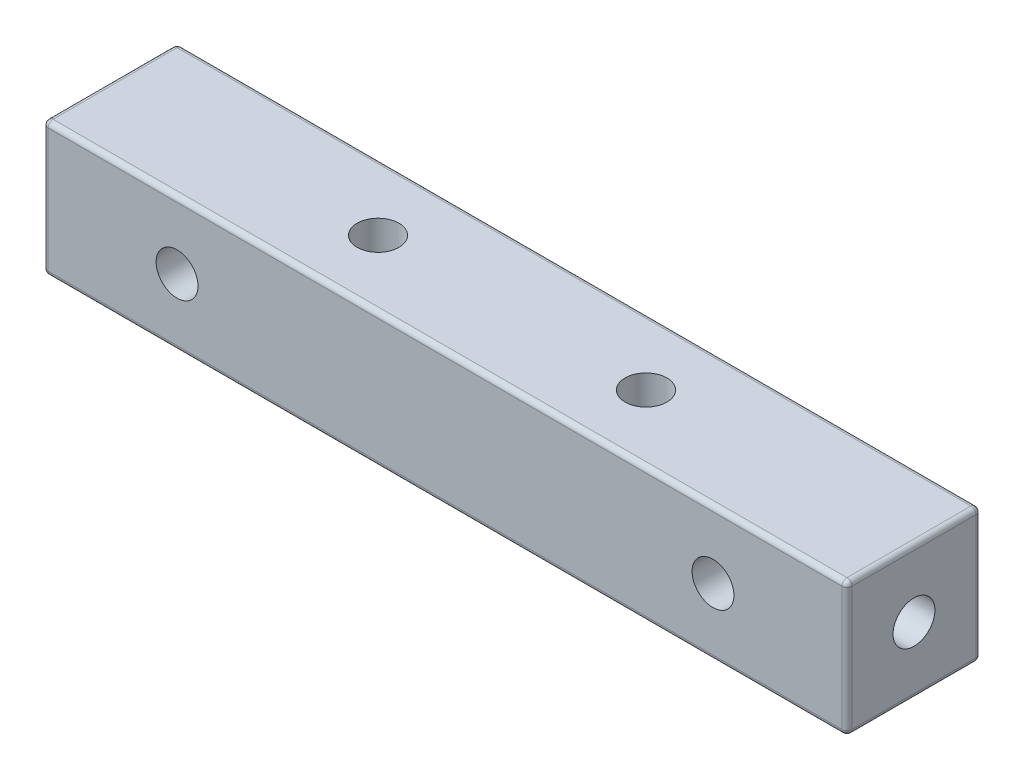
ISO-10303-21;
HEADER;
FILE_DESCRIPTION(('STEP AP214'),'2;1');
FILE_NAME('part.step','',(''),(''),'','','');
FILE_SCHEMA(('AUTOMOTIVE_DESIGN { 1 0 10303 214 1 1 1 1 }'));
ENDSEC;
DATA;
#1=APPLICATION_CONTEXT('core data for automotive mechanical design processes');
#2=APPLICATION_PROTOCOL_DEFINITION('international standard','automotive_design',2000,#1);
#3=PRODUCT_CONTEXT('',#1,'mechanical');
#4=PRODUCT('Part','Part','',(#3));
#5=PRODUCT_RELATED_PRODUCT_CATEGORY('part','',(#4));
#6=PRODUCT_DEFINITION_FORMATION('','',#4);
#7=PRODUCT_DEFINITION_CONTEXT('part definition',#1,'design');
#8=PRODUCT_DEFINITION('design','',#6,#7);
#9=PRODUCT_DEFINITION_SHAPE('','',#8);
#10=(LENGTH_UNIT() NAMED_UNIT(*) SI_UNIT(.MILLI.,.METRE.));
#11=(NAMED_UNIT(*) PLANE_ANGLE_UNIT() SI_UNIT($,.RADIAN.));
#12=(NAMED_UNIT(*) SI_UNIT($,.STERADIAN.) SOLID_ANGLE_UNIT());
#13=UNCERTAINTY_MEASURE_WITH_UNIT(LENGTH_MEASURE(1.E-05),#10,'distance_accuracy_value','');
#14=(GEOMETRIC_REPRESENTATION_CONTEXT(3) GLOBAL_UNCERTAINTY_ASSIGNED_CONTEXT((#13)) GLOBAL_UNIT_ASSIGNED_CONTEXT((#10,
#11,#12)) REPRESENTATION_CONTEXT('',''));
#15=CARTESIAN_POINT('',(0.,0.,0.));
#16=DIRECTION('',(0.,0.,1.));
#17=DIRECTION('',(1.,0.,0.));
#18=AXIS2_PLACEMENT_3D('',#15,#16,#17);
#19=CARTESIAN_POINT('',(24.,-4.,-4.));
#20=DIRECTION('',(0.,0.,1.));
#21=DIRECTION('',(0.,-1.,0.));
#22=AXIS2_PLACEMENT_3D('',#19,#20,#21);
#23=PLANE('',#22);
#24=CARTESIAN_POINT('',(-16.,0.,-4.));
#25=DIRECTION('',(0.,0.,1.));
#26=DIRECTION('',(1.,0.,0.));
#27=AXIS2_PLACEMENT_3D('',#24,#25,#26);
#28=CIRCLE('',#27,1.25);
#29=CARTESIAN_POINT('',(-14.75,0.,-4.));
#30=VERTEX_POINT('',#29);
#31=EDGE_CURVE('E152',#30,#30,#28,.T.);
#32=ORIENTED_EDGE('',*,*,#31,.T.);
#33=EDGE_LOOP('',(#32));
#34=FACE_BOUND('',#33,.T.);
#35=CARTESIAN_POINT('',(16.,0.,-4.));
#36=DIRECTION('',(0.,0.,1.));
#37=DIRECTION('',(1.,0.,0.));
#38=AXIS2_PLACEMENT_3D('',#35,#36,#37);
#39=CIRCLE('',#38,1.25);
#40=CARTESIAN_POINT('',(17.25,0.,-4.));
#41=VERTEX_POINT('',#40);
#42=EDGE_CURVE('E147',#41,#41,#39,.T.);
#43=ORIENTED_EDGE('',*,*,#42,.T.);
#44=EDGE_LOOP('',(#43));
#45=FACE_BOUND('',#44,.T.);
#46=DIRECTION('',(0.,1.,0.));
#47=VECTOR('',#46,1.);
#48=CARTESIAN_POINT('',(23.7,-4.,-4.));
#49=LINE('',#48,#47);
#50=CARTESIAN_POINT('',(23.7,3.7,-4.));
#51=VERTEX_POINT('',#50);
#52=CARTESIAN_POINT('',(23.7,-3.7,-4.));
#53=VERTEX_POINT('',#52);
#54=EDGE_CURVE('E175',#51,#53,#49,.F.);
#55=ORIENTED_EDGE('',*,*,#54,.T.);
#56=DIRECTION('',(-1.,0.,0.));
#57=VECTOR('',#56,1.);
#58=CARTESIAN_POINT('',(24.,-3.7,-4.));
#59=LINE('',#58,#57);
#60=CARTESIAN_POINT('',(-23.7,-3.7,-4.));
#61=VERTEX_POINT('',#60);
#62=EDGE_CURVE('E181',#53,#61,#59,.T.);
#63=ORIENTED_EDGE('',*,*,#62,.T.);
#64=DIRECTION('',(0.,1.,0.));
#65=VECTOR('',#64,1.);
#66=CARTESIAN_POINT('',(-23.7,4.,-4.));
#67=LINE('',#66,#65);
#68=CARTESIAN_POINT('',(-23.7,3.7,-4.));
#69=VERTEX_POINT('',#68);
#70=EDGE_CURVE('E178',#61,#69,#67,.T.);
#71=ORIENTED_EDGE('',*,*,#70,.T.);
#72=DIRECTION('',(-1.,0.,0.));
#73=VECTOR('',#72,1.);
#74=CARTESIAN_POINT('',(24.,3.7,-4.));
#75=LINE('',#74,#73);
#76=EDGE_CURVE('E173',#69,#51,#75,.F.);
#77=ORIENTED_EDGE('',*,*,#76,.T.);
#78=EDGE_LOOP('',(#55,#63,#71,#77));
#79=FACE_BOUND('',#78,.T.);
#80=ADVANCED_FACE('F39',(#34,#45,#79),#23,.F.);
#81=CARTESIAN_POINT('',(24.,4.,4.));
#82=DIRECTION('',(0.,-1.,0.));
#83=DIRECTION('',(0.,0.,-1.));
#84=AXIS2_PLACEMENT_3D('',#81,#82,#83);
#85=PLANE('',#84);
#86=CARTESIAN_POINT('',(-8.,4.,0.));
#87=DIRECTION('',(0.,1.,0.));
#88=DIRECTION('',(0.,0.,1.));
#89=AXIS2_PLACEMENT_3D('',#86,#87,#88);
#90=CIRCLE('',#89,1.25);
#91=CARTESIAN_POINT('',(-8.,4.,1.25));
#92=VERTEX_POINT('',#91);
#93=EDGE_CURVE('E154',#92,#92,#90,.T.);
#94=ORIENTED_EDGE('',*,*,#93,.F.);
#95=EDGE_LOOP('',(#94));
#96=FACE_BOUND('',#95,.T.);
#97=CARTESIAN_POINT('',(8.,4.,0.));
#98=DIRECTION('',(0.,1.,0.));
#99=DIRECTION('',(0.,0.,1.));
#100=AXIS2_PLACEMENT_3D('',#97,#98,#99);
#101=CIRCLE('',#100,1.25);
#102=CARTESIAN_POINT('',(8.,4.,1.25));
#103=VERTEX_POINT('',#102);
#104=EDGE_CURVE('E166',#103,#103,#101,.T.);
#105=ORIENTED_EDGE('',*,*,#104,.F.);
#106=EDGE_LOOP('',(#105));
#107=FACE_BOUND('',#106,.T.);
#108=DIRECTION('',(0.,0.,1.));
#109=VECTOR('',#108,1.);
#110=CARTESIAN_POINT('',(-23.7,4.,4.));
#111=LINE('',#110,#109);
#112=CARTESIAN_POINT('',(-23.7,4.,-3.7));
#113=VERTEX_POINT('',#112);
#114=CARTESIAN_POINT('',(-23.7,4.,3.7));
#115=VERTEX_POINT('',#114);
#116=EDGE_CURVE('E196',#113,#115,#111,.T.);
#117=ORIENTED_EDGE('',*,*,#116,.T.);
#118=DIRECTION('',(-1.,0.,0.));
#119=VECTOR('',#118,1.);
#120=CARTESIAN_POINT('',(24.,4.,3.7));
#121=LINE('',#120,#119);
#122=CARTESIAN_POINT('',(23.7,4.,3.7));
#123=VERTEX_POINT('',#122);
#124=EDGE_CURVE('E199',#115,#123,#121,.F.);
#125=ORIENTED_EDGE('',*,*,#124,.T.);
#126=DIRECTION('',(0.,0.,1.));
#127=VECTOR('',#126,1.);
#128=CARTESIAN_POINT('',(23.7,4.,4.));
#129=LINE('',#128,#127);
#130=CARTESIAN_POINT('',(23.7,4.,-3.7));
#131=VERTEX_POINT('',#130);
#132=EDGE_CURVE('E194',#123,#131,#129,.F.);
#133=ORIENTED_EDGE('',*,*,#132,.T.);
#134=DIRECTION('',(-1.,0.,0.));
#135=VECTOR('',#134,1.);
#136=CARTESIAN_POINT('',(24.,4.,-3.7));
#137=LINE('',#136,#135);
#138=EDGE_CURVE('E192',#131,#113,#137,.T.);
#139=ORIENTED_EDGE('',*,*,#138,.T.);
#140=EDGE_LOOP('',(#117,#125,#133,#139));
#141=FACE_BOUND('',#140,.T.);
#142=ADVANCED_FACE('F353',(#96,#107,#141),#85,.F.);
#143=CARTESIAN_POINT('',(24.,-4.,4.));
#144=DIRECTION('',(0.,0.,-1.));
#145=DIRECTION('',(-1.,0.,0.));
#146=AXIS2_PLACEMENT_3D('',#143,#144,#145);
#147=PLANE('',#146);
#148=CARTESIAN_POINT('',(-16.,0.,4.));
#149=DIRECTION('',(0.,0.,1.));
#150=DIRECTION('',(1.,0.,0.));
#151=AXIS2_PLACEMENT_3D('',#148,#149,#150);
#152=CIRCLE('',#151,1.25);
#153=CARTESIAN_POINT('',(-14.75,0.,4.));
#154=VERTEX_POINT('',#153);
#155=EDGE_CURVE('E157',#154,#154,#152,.T.);
#156=ORIENTED_EDGE('',*,*,#155,.F.);
#157=EDGE_LOOP('',(#156));
#158=FACE_BOUND('',#157,.T.);
#159=CARTESIAN_POINT('',(16.,0.,4.));
#160=DIRECTION('',(0.,0.,1.));
#161=DIRECTION('',(1.,0.,0.));
#162=AXIS2_PLACEMENT_3D('',#159,#160,#161);
#163=CIRCLE('',#162,1.25);
#164=CARTESIAN_POINT('',(17.25,0.,4.));
#165=VERTEX_POINT('',#164);
#166=EDGE_CURVE('E150',#165,#165,#163,.T.);
#167=ORIENTED_EDGE('',*,*,#166,.F.);
#168=EDGE_LOOP('',(#167));
#169=FACE_BOUND('',#168,.T.);
#170=DIRECTION('',(0.,-1.,0.));
#171=VECTOR('',#170,1.);
#172=CARTESIAN_POINT('',(23.7,-4.,4.));
#173=LINE('',#172,#171);
#174=CARTESIAN_POINT('',(23.7,-3.7,4.));
#175=VERTEX_POINT('',#174);
#176=CARTESIAN_POINT('',(23.7,3.7,4.));
#177=VERTEX_POINT('',#176);
#178=EDGE_CURVE('E203',#175,#177,#173,.F.);
#179=ORIENTED_EDGE('',*,*,#178,.T.);
#180=DIRECTION('',(-1.,0.,0.));
#181=VECTOR('',#180,1.);
#182=CARTESIAN_POINT('',(24.,3.7,4.));
#183=LINE('',#182,#181);
#184=CARTESIAN_POINT('',(-23.7,3.7,4.));
#185=VERTEX_POINT('',#184);
#186=EDGE_CURVE('E208',#177,#185,#183,.T.);
#187=ORIENTED_EDGE('',*,*,#186,.T.);
#188=DIRECTION('',(0.,-1.,0.));
#189=VECTOR('',#188,1.);
#190=CARTESIAN_POINT('',(-23.7,-4.,4.));
#191=LINE('',#190,#189);
#192=CARTESIAN_POINT('',(-23.7,-3.7,4.));
#193=VERTEX_POINT('',#192);
#194=EDGE_CURVE('E205',#185,#193,#191,.T.);
#195=ORIENTED_EDGE('',*,*,#194,.T.);
#196=DIRECTION('',(-1.,0.,0.));
#197=VECTOR('',#196,1.);
#198=CARTESIAN_POINT('',(24.,-3.7,4.));
#199=LINE('',#198,#197);
#200=EDGE_CURVE('E201',#193,#175,#199,.F.);
#201=ORIENTED_EDGE('',*,*,#200,.T.);
#202=EDGE_LOOP('',(#179,#187,#195,#201));
#203=FACE_BOUND('',#202,.T.);
#204=ADVANCED_FACE('F416',(#158,#169,#203),#147,.F.);
#205=CARTESIAN_POINT('',(24.,-4.,4.));
#206=DIRECTION('',(0.,1.,0.));
#207=DIRECTION('',(0.,0.,1.));
#208=AXIS2_PLACEMENT_3D('',#205,#206,#207);
#209=PLANE('',#208);
#210=CARTESIAN_POINT('',(-8.,-4.,0.));
#211=DIRECTION('',(0.,1.,0.));
#212=DIRECTION('',(0.,0.,1.));
#213=AXIS2_PLACEMENT_3D('',#210,#211,#212);
#214=CIRCLE('',#213,1.25);
#215=CARTESIAN_POINT('',(-8.,-4.,1.25));
#216=VERTEX_POINT('',#215);
#217=EDGE_CURVE('E163',#216,#216,#214,.T.);
#218=ORIENTED_EDGE('',*,*,#217,.T.);
#219=EDGE_LOOP('',(#218));
#220=FACE_BOUND('',#219,.T.);
#221=CARTESIAN_POINT('',(8.,-4.,0.));
#222=DIRECTION('',(0.,1.,0.));
#223=DIRECTION('',(0.,0.,1.));
#224=AXIS2_PLACEMENT_3D('',#221,#222,#223);
#225=CIRCLE('',#224,1.25);
#226=CARTESIAN_POINT('',(8.,-4.,1.24999999999999));
#227=VERTEX_POINT('',#226);
#228=EDGE_CURVE('E169',#227,#227,#225,.T.);
#229=ORIENTED_EDGE('',*,*,#228,.T.);
#230=EDGE_LOOP('',(#229));
#231=FACE_BOUND('',#230,.T.);
#232=DIRECTION('',(0.,0.,-1.));
#233=VECTOR('',#232,1.);
#234=CARTESIAN_POINT('',(-23.7,-4.,-4.));
#235=LINE('',#234,#233);
#236=CARTESIAN_POINT('',(-23.7,-4.,3.7));
#237=VERTEX_POINT('',#236);
#238=CARTESIAN_POINT('',(-23.7,-4.,-3.7));
#239=VERTEX_POINT('',#238);
#240=EDGE_CURVE('E214',#237,#239,#235,.T.);
#241=ORIENTED_EDGE('',*,*,#240,.T.);
#242=DIRECTION('',(-1.,0.,0.));
#243=VECTOR('',#242,1.);
#244=CARTESIAN_POINT('',(24.,-4.,-3.7));
#245=LINE('',#244,#243);
#246=CARTESIAN_POINT('',(23.7,-4.,-3.7));
#247=VERTEX_POINT('',#246);
#248=EDGE_CURVE('E217',#239,#247,#245,.F.);
#249=ORIENTED_EDGE('',*,*,#248,.T.);
#250=DIRECTION('',(0.,0.,-1.));
#251=VECTOR('',#250,1.);
#252=CARTESIAN_POINT('',(23.7,-4.,4.));
#253=LINE('',#252,#251);
#254=CARTESIAN_POINT('',(23.7,-4.,3.7));
#255=VERTEX_POINT('',#254);
#256=EDGE_CURVE('E212',#247,#255,#253,.F.);
#257=ORIENTED_EDGE('',*,*,#256,.T.);
#258=DIRECTION('',(-1.,0.,0.));
#259=VECTOR('',#258,1.);
#260=CARTESIAN_POINT('',(24.,-4.,3.7));
#261=LINE('',#260,#259);
#262=EDGE_CURVE('E210',#255,#237,#261,.T.);
#263=ORIENTED_EDGE('',*,*,#262,.T.);
#264=EDGE_LOOP('',(#241,#249,#257,#263));
#265=FACE_BOUND('',#264,.T.);
#266=ADVANCED_FACE('F315',(#220,#231,#265),#209,.F.);
#267=CARTESIAN_POINT('',(24.,0.,0.));
#268=DIRECTION('',(-1.,0.,0.));
#269=DIRECTION('',(0.,0.,1.));
#270=AXIS2_PLACEMENT_3D('',#267,#268,#269);
#271=PLANE('',#270);
#272=CARTESIAN_POINT('',(24.,0.,0.));
#273=DIRECTION('',(1.,0.,0.));
#274=DIRECTION('',(0.,0.,-1.));
#275=AXIS2_PLACEMENT_3D('',#272,#273,#274);
#276=CIRCLE('',#275,1.25);
#277=CARTESIAN_POINT('',(24.,0.,-1.25));
#278=VERTEX_POINT('',#277);
#279=EDGE_CURVE('E304',#278,#278,#276,.T.);
#280=ORIENTED_EDGE('',*,*,#279,.F.);
#281=EDGE_LOOP('',(#280));
#282=FACE_BOUND('',#281,.T.);
#283=DIRECTION('',(0.,0.,-1.));
#284=VECTOR('',#283,1.);
#285=CARTESIAN_POINT('',(24.,-3.7,0.));
#286=LINE('',#285,#284);
#287=CARTESIAN_POINT('',(24.,-3.7,3.7));
#288=VERTEX_POINT('',#287);
#289=CARTESIAN_POINT('',(24.,-3.7,-3.7));
#290=VERTEX_POINT('',#289);
#291=EDGE_CURVE('E219',#288,#290,#286,.T.);
#292=ORIENTED_EDGE('',*,*,#291,.T.);
#293=DIRECTION('',(0.,1.,0.));
#294=VECTOR('',#293,1.);
#295=CARTESIAN_POINT('',(24.,0.,-3.7));
#296=LINE('',#295,#294);
#297=CARTESIAN_POINT('',(24.,3.7,-3.7));
#298=VERTEX_POINT('',#297);
#299=EDGE_CURVE('E225',#290,#298,#296,.T.);
#300=ORIENTED_EDGE('',*,*,#299,.T.);
#301=DIRECTION('',(0.,0.,1.));
#302=VECTOR('',#301,1.);
#303=CARTESIAN_POINT('',(24.,3.7,0.));
#304=LINE('',#303,#302);
#305=CARTESIAN_POINT('',(24.,3.7,3.7));
#306=VERTEX_POINT('',#305);
#307=EDGE_CURVE('E223',#298,#306,#304,.T.);
#308=ORIENTED_EDGE('',*,*,#307,.T.);
#309=DIRECTION('',(0.,-1.,0.));
#310=VECTOR('',#309,1.);
#311=CARTESIAN_POINT('',(24.,0.,3.7));
#312=LINE('',#311,#310);
#313=EDGE_CURVE('E221',#306,#288,#312,.T.);
#314=ORIENTED_EDGE('',*,*,#313,.T.);
#315=EDGE_LOOP('',(#292,#300,#308,#314));
#316=FACE_BOUND('',#315,.T.);
#317=ADVANCED_FACE('F311',(#282,#316),#271,.F.);
#318=CARTESIAN_POINT('',(-24.,0.,0.));
#319=DIRECTION('',(-1.,0.,0.));
#320=DIRECTION('',(0.,0.,1.));
#321=AXIS2_PLACEMENT_3D('',#318,#319,#320);
#322=PLANE('',#321);
#323=CARTESIAN_POINT('',(-24.,0.,0.));
#324=DIRECTION('',(-1.,0.,0.));
#325=DIRECTION('',(0.,0.,1.));
#326=AXIS2_PLACEMENT_3D('',#323,#324,#325);
#327=CIRCLE('',#326,1.25);
#328=CARTESIAN_POINT('',(-24.,0.,1.25));
#329=VERTEX_POINT('',#328);
#330=EDGE_CURVE('E302',#329,#329,#327,.T.);
#331=ORIENTED_EDGE('',*,*,#330,.F.);
#332=EDGE_LOOP('',(#331));
#333=FACE_BOUND('',#332,.T.);
#334=DIRECTION('',(0.,0.,1.));
#335=VECTOR('',#334,1.);
#336=CARTESIAN_POINT('',(-24.,3.7,-4.));
#337=LINE('',#336,#335);
#338=CARTESIAN_POINT('',(-24.,3.7,3.7));
#339=VERTEX_POINT('',#338);
#340=CARTESIAN_POINT('',(-24.,3.7,-3.7));
#341=VERTEX_POINT('',#340);
#342=EDGE_CURVE('E187',#339,#341,#337,.F.);
#343=ORIENTED_EDGE('',*,*,#342,.T.);
#344=DIRECTION('',(0.,1.,0.));
#345=VECTOR('',#344,1.);
#346=CARTESIAN_POINT('',(-24.,-4.,-3.7));
#347=LINE('',#346,#345);
#348=CARTESIAN_POINT('',(-24.,-3.7,-3.7));
#349=VERTEX_POINT('',#348);
#350=EDGE_CURVE('E189',#341,#349,#347,.F.);
#351=ORIENTED_EDGE('',*,*,#350,.T.);
#352=DIRECTION('',(0.,0.,-1.));
#353=VECTOR('',#352,1.);
#354=CARTESIAN_POINT('',(-24.,-3.7,4.));
#355=LINE('',#354,#353);
#356=CARTESIAN_POINT('',(-24.,-3.7,3.7));
#357=VERTEX_POINT('',#356);
#358=EDGE_CURVE('E183',#349,#357,#355,.F.);
#359=ORIENTED_EDGE('',*,*,#358,.T.);
#360=DIRECTION('',(0.,-1.,0.));
#361=VECTOR('',#360,1.);
#362=CARTESIAN_POINT('',(-24.,4.,3.7));
#363=LINE('',#362,#361);
#364=EDGE_CURVE('E185',#357,#339,#363,.F.);
#365=ORIENTED_EDGE('',*,*,#364,.T.);
#366=EDGE_LOOP('',(#343,#351,#359,#365));
#367=FACE_BOUND('',#366,.T.);
#368=ADVANCED_FACE('F314',(#333,#367),#322,.T.);
#369=CARTESIAN_POINT('',(23.7,0.,3.7));
#370=DIRECTION('',(0.,-1.,0.));
#371=DIRECTION('',(0.,0.,-1.));
#372=AXIS2_PLACEMENT_3D('',#369,#370,#371);
#373=CYLINDRICAL_SURFACE('',#372,0.3);
#374=CARTESIAN_POINT('',(23.7,-3.7,3.7));
#375=DIRECTION('',(0.,-1.,0.));
#376=DIRECTION('',(0.,0.,-1.));
#377=AXIS2_PLACEMENT_3D('',#374,#375,#376);
#378=CIRCLE('',#377,0.3);
#379=EDGE_CURVE('E176',#288,#175,#378,.T.);
#380=ORIENTED_EDGE('',*,*,#379,.F.);
#381=ORIENTED_EDGE('',*,*,#313,.F.);
#382=CARTESIAN_POINT('',(23.7,3.7,3.7));
#383=DIRECTION('',(0.,1.,0.));
#384=DIRECTION('',(0.,0.,1.));
#385=AXIS2_PLACEMENT_3D('',#382,#383,#384);
#386=CIRCLE('',#385,0.3);
#387=EDGE_CURVE('E288',#177,#306,#386,.T.);
#388=ORIENTED_EDGE('',*,*,#387,.F.);
#389=ORIENTED_EDGE('',*,*,#178,.F.);
#390=EDGE_LOOP('',(#380,#381,#388,#389));
#391=FACE_BOUND('',#390,.T.);
#392=ADVANCED_FACE('F41',(#391),#373,.T.);
#393=CARTESIAN_POINT('',(23.7,-3.7,3.7));
#394=DIRECTION('',(0.,0.,1.));
#395=DIRECTION('',(1.,0.,0.));
#396=AXIS2_PLACEMENT_3D('',#393,#394,#395);
#397=SPHERICAL_SURFACE('',#396,0.3);
#398=CARTESIAN_POINT('',(23.7,-3.7,3.7));
#399=DIRECTION('',(0.,0.,1.));
#400=DIRECTION('',(1.,0.,0.));
#401=AXIS2_PLACEMENT_3D('',#398,#399,#400);
#402=CIRCLE('',#401,0.3);
#403=EDGE_CURVE('E282',#288,#255,#402,.F.);
#404=ORIENTED_EDGE('',*,*,#403,.F.);
#405=ORIENTED_EDGE('',*,*,#379,.T.);
#406=CARTESIAN_POINT('',(23.7,-3.7,3.7));
#407=DIRECTION('',(1.,0.,0.));
#408=DIRECTION('',(0.,0.,-1.));
#409=AXIS2_PLACEMENT_3D('',#406,#407,#408);
#410=CIRCLE('',#409,0.3);
#411=EDGE_CURVE('E285',#255,#175,#410,.F.);
#412=ORIENTED_EDGE('',*,*,#411,.F.);
#413=EDGE_LOOP('',(#404,#405,#412));
#414=FACE_BOUND('',#413,.T.);
#415=ADVANCED_FACE('F381',(#414),#397,.T.);
#416=CARTESIAN_POINT('',(23.7,3.7,3.7));
#417=DIRECTION('',(1.,0.,0.));
#418=DIRECTION('',(0.,0.,-1.));
#419=AXIS2_PLACEMENT_3D('',#416,#417,#418);
#420=SPHERICAL_SURFACE('',#419,0.3);
#421=CARTESIAN_POINT('',(23.7,3.7,3.7));
#422=DIRECTION('',(1.,0.,0.));
#423=DIRECTION('',(0.,0.,-1.));
#424=AXIS2_PLACEMENT_3D('',#421,#422,#423);
#425=CIRCLE('',#424,0.3);
#426=EDGE_CURVE('E276',#177,#123,#425,.F.);
#427=ORIENTED_EDGE('',*,*,#426,.F.);
#428=ORIENTED_EDGE('',*,*,#387,.T.);
#429=CARTESIAN_POINT('',(23.7,3.7,3.7));
#430=DIRECTION('',(0.,0.,1.));
#431=DIRECTION('',(1.,0.,0.));
#432=AXIS2_PLACEMENT_3D('',#429,#430,#431);
#433=CIRCLE('',#432,0.3);
#434=EDGE_CURVE('E279',#123,#306,#433,.F.);
#435=ORIENTED_EDGE('',*,*,#434,.F.);
#436=EDGE_LOOP('',(#427,#428,#435));
#437=FACE_BOUND('',#436,.T.);
#438=ADVANCED_FACE('F372',(#437),#420,.T.);
#439=CARTESIAN_POINT('',(24.,-3.7,3.7));
#440=DIRECTION('',(-1.,0.,0.));
#441=DIRECTION('',(0.,0.,1.));
#442=AXIS2_PLACEMENT_3D('',#439,#440,#441);
#443=CYLINDRICAL_SURFACE('',#442,0.3);
#444=ORIENTED_EDGE('',*,*,#411,.T.);
#445=ORIENTED_EDGE('',*,*,#200,.F.);
#446=CARTESIAN_POINT('',(-23.7,-3.7,3.7));
#447=DIRECTION('',(-1.,0.,0.));
#448=DIRECTION('',(0.,0.,1.));
#449=AXIS2_PLACEMENT_3D('',#446,#447,#448);
#450=CIRCLE('',#449,0.3);
#451=EDGE_CURVE('E271',#237,#193,#450,.T.);
#452=ORIENTED_EDGE('',*,*,#451,.F.);
#453=ORIENTED_EDGE('',*,*,#262,.F.);
#454=EDGE_LOOP('',(#444,#445,#452,#453));
#455=FACE_BOUND('',#454,.T.);
#456=ADVANCED_FACE('F386',(#455),#443,.T.);
#457=CARTESIAN_POINT('',(23.7,-3.7,0.));
#458=DIRECTION('',(0.,0.,-1.));
#459=DIRECTION('',(-1.,0.,0.));
#460=AXIS2_PLACEMENT_3D('',#457,#458,#459);
#461=CYLINDRICAL_SURFACE('',#460,0.3);
#462=ORIENTED_EDGE('',*,*,#403,.T.);
#463=ORIENTED_EDGE('',*,*,#256,.F.);
#464=CARTESIAN_POINT('',(23.7,-3.7,-3.7));
#465=DIRECTION('',(0.,0.,-1.));
#466=DIRECTION('',(-1.,0.,0.));
#467=AXIS2_PLACEMENT_3D('',#464,#465,#466);
#468=CIRCLE('',#467,0.3);
#469=EDGE_CURVE('E268',#290,#247,#468,.T.);
#470=ORIENTED_EDGE('',*,*,#469,.F.);
#471=ORIENTED_EDGE('',*,*,#291,.F.);
#472=EDGE_LOOP('',(#462,#463,#470,#471));
#473=FACE_BOUND('',#472,.T.);
#474=ADVANCED_FACE('F331',(#473),#461,.T.);
#475=CARTESIAN_POINT('',(23.7,0.,-3.7));
#476=DIRECTION('',(0.,1.,0.));
#477=DIRECTION('',(0.,0.,1.));
#478=AXIS2_PLACEMENT_3D('',#475,#476,#477);
#479=CYLINDRICAL_SURFACE('',#478,0.3);
#480=CARTESIAN_POINT('',(23.7,3.7,-3.7));
#481=DIRECTION('',(0.,1.,0.));
#482=DIRECTION('',(0.,0.,1.));
#483=AXIS2_PLACEMENT_3D('',#480,#481,#482);
#484=CIRCLE('',#483,0.3);
#485=EDGE_CURVE('E262',#298,#51,#484,.T.);
#486=ORIENTED_EDGE('',*,*,#485,.F.);
#487=ORIENTED_EDGE('',*,*,#299,.F.);
#488=CARTESIAN_POINT('',(23.7,-3.7,-3.7));
#489=DIRECTION('',(0.,-1.,0.));
#490=DIRECTION('',(0.,0.,-1.));
#491=AXIS2_PLACEMENT_3D('',#488,#489,#490);
#492=CIRCLE('',#491,0.3);
#493=EDGE_CURVE('E265',#53,#290,#492,.T.);
#494=ORIENTED_EDGE('',*,*,#493,.F.);
#495=ORIENTED_EDGE('',*,*,#54,.F.);
#496=EDGE_LOOP('',(#486,#487,#494,#495));
#497=FACE_BOUND('',#496,.T.);
#498=ADVANCED_FACE('F326',(#497),#479,.T.);
#499=CARTESIAN_POINT('',(23.7,3.7,0.));
#500=DIRECTION('',(0.,0.,1.));
#501=DIRECTION('',(0.,-1.,0.));
#502=AXIS2_PLACEMENT_3D('',#499,#500,#501);
#503=CYLINDRICAL_SURFACE('',#502,0.3);
#504=ORIENTED_EDGE('',*,*,#434,.T.);
#505=ORIENTED_EDGE('',*,*,#307,.F.);
#506=CARTESIAN_POINT('',(23.7,3.7,-3.7));
#507=DIRECTION('',(0.,0.,-1.));
#508=DIRECTION('',(-1.,0.,0.));
#509=AXIS2_PLACEMENT_3D('',#506,#507,#508);
#510=CIRCLE('',#509,0.3);
#511=EDGE_CURVE('E260',#131,#298,#510,.T.);
#512=ORIENTED_EDGE('',*,*,#511,.F.);
#513=ORIENTED_EDGE('',*,*,#132,.F.);
#514=EDGE_LOOP('',(#504,#505,#512,#513));
#515=FACE_BOUND('',#514,.T.);
#516=ADVANCED_FACE('F375',(#515),#503,.T.);
#517=CARTESIAN_POINT('',(24.,3.7,3.7));
#518=DIRECTION('',(-1.,0.,0.));
#519=DIRECTION('',(0.,0.,1.));
#520=AXIS2_PLACEMENT_3D('',#517,#518,#519);
#521=CYLINDRICAL_SURFACE('',#520,0.3);
#522=ORIENTED_EDGE('',*,*,#426,.T.);
#523=ORIENTED_EDGE('',*,*,#124,.F.);
#524=CARTESIAN_POINT('',(-23.7,3.7,3.7));
#525=DIRECTION('',(-1.,0.,0.));
#526=DIRECTION('',(0.,0.,1.));
#527=AXIS2_PLACEMENT_3D('',#524,#525,#526);
#528=CIRCLE('',#527,0.3);
#529=EDGE_CURVE('E257',#185,#115,#528,.T.);
#530=ORIENTED_EDGE('',*,*,#529,.F.);
#531=ORIENTED_EDGE('',*,*,#186,.F.);
#532=EDGE_LOOP('',(#522,#523,#530,#531));
#533=FACE_BOUND('',#532,.T.);
#534=ADVANCED_FACE('F368',(#533),#521,.T.);
#535=CARTESIAN_POINT('',(-23.7,-4.,3.7));
#536=DIRECTION('',(0.,1.,0.));
#537=DIRECTION('',(0.,0.,1.));
#538=AXIS2_PLACEMENT_3D('',#535,#536,#537);
#539=CYLINDRICAL_SURFACE('',#538,0.3);
#540=CARTESIAN_POINT('',(-23.7,-3.7,3.7));
#541=DIRECTION('',(0.,-1.,0.));
#542=DIRECTION('',(0.,0.,-1.));
#543=AXIS2_PLACEMENT_3D('',#540,#541,#542);
#544=CIRCLE('',#543,0.3);
#545=EDGE_CURVE('E273',#193,#357,#544,.T.);
#546=ORIENTED_EDGE('',*,*,#545,.F.);
#547=ORIENTED_EDGE('',*,*,#194,.F.);
#548=CARTESIAN_POINT('',(-23.7,3.7,3.7));
#549=DIRECTION('',(0.,1.,0.));
#550=DIRECTION('',(0.,0.,1.));
#551=AXIS2_PLACEMENT_3D('',#548,#549,#550);
#552=CIRCLE('',#551,0.3);
#553=EDGE_CURVE('E254',#339,#185,#552,.T.);
#554=ORIENTED_EDGE('',*,*,#553,.F.);
#555=ORIENTED_EDGE('',*,*,#364,.F.);
#556=EDGE_LOOP('',(#546,#547,#554,#555));
#557=FACE_BOUND('',#556,.T.);
#558=ADVANCED_FACE('F608',(#557),#539,.T.);
#559=CARTESIAN_POINT('',(-23.7,-3.7,3.7));
#560=DIRECTION('',(0.,0.,1.));
#561=DIRECTION('',(1.,0.,0.));
#562=AXIS2_PLACEMENT_3D('',#559,#560,#561);
#563=SPHERICAL_SURFACE('',#562,0.3);
#564=ORIENTED_EDGE('',*,*,#451,.T.);
#565=ORIENTED_EDGE('',*,*,#545,.T.);
#566=CARTESIAN_POINT('',(-23.7,-3.7,3.7));
#567=DIRECTION('',(0.,0.,1.));
#568=DIRECTION('',(1.,0.,0.));
#569=AXIS2_PLACEMENT_3D('',#566,#567,#568);
#570=CIRCLE('',#569,0.3);
#571=EDGE_CURVE('E251',#237,#357,#570,.F.);
#572=ORIENTED_EDGE('',*,*,#571,.F.);
#573=EDGE_LOOP('',(#564,#565,#572));
#574=FACE_BOUND('',#573,.T.);
#575=ADVANCED_FACE('F615',(#574),#563,.T.);
#576=CARTESIAN_POINT('',(23.7,-3.7,-3.7));
#577=DIRECTION('',(1.,0.,0.));
#578=DIRECTION('',(0.,0.,-1.));
#579=AXIS2_PLACEMENT_3D('',#576,#577,#578);
#580=SPHERICAL_SURFACE('',#579,0.3);
#581=ORIENTED_EDGE('',*,*,#493,.T.);
#582=ORIENTED_EDGE('',*,*,#469,.T.);
#583=CARTESIAN_POINT('',(23.7,-3.7,-3.7));
#584=DIRECTION('',(1.,0.,0.));
#585=DIRECTION('',(0.,0.,-1.));
#586=AXIS2_PLACEMENT_3D('',#583,#584,#585);
#587=CIRCLE('',#586,0.3);
#588=EDGE_CURVE('E248',#53,#247,#587,.F.);
#589=ORIENTED_EDGE('',*,*,#588,.F.);
#590=EDGE_LOOP('',(#581,#582,#589));
#591=FACE_BOUND('',#590,.T.);
#592=ADVANCED_FACE('F333',(#591),#580,.T.);
#593=CARTESIAN_POINT('',(23.7,3.7,-3.7));
#594=DIRECTION('',(1.,0.,0.));
#595=DIRECTION('',(0.,0.,-1.));
#596=AXIS2_PLACEMENT_3D('',#593,#594,#595);
#597=SPHERICAL_SURFACE('',#596,0.3);
#598=ORIENTED_EDGE('',*,*,#511,.T.);
#599=ORIENTED_EDGE('',*,*,#485,.T.);
#600=CARTESIAN_POINT('',(23.7,3.7,-3.7));
#601=DIRECTION('',(1.,0.,0.));
#602=DIRECTION('',(0.,0.,-1.));
#603=AXIS2_PLACEMENT_3D('',#600,#601,#602);
#604=CIRCLE('',#603,0.3);
#605=EDGE_CURVE('E245',#131,#51,#604,.F.);
#606=ORIENTED_EDGE('',*,*,#605,.F.);
#607=EDGE_LOOP('',(#598,#599,#606));
#608=FACE_BOUND('',#607,.T.);
#609=ADVANCED_FACE('F345',(#608),#597,.T.);
#610=CARTESIAN_POINT('',(-23.7,3.7,3.7));
#611=DIRECTION('',(0.,0.,1.));
#612=DIRECTION('',(1.,0.,0.));
#613=AXIS2_PLACEMENT_3D('',#610,#611,#612);
#614=SPHERICAL_SURFACE('',#613,0.3);
#615=ORIENTED_EDGE('',*,*,#553,.T.);
#616=ORIENTED_EDGE('',*,*,#529,.T.);
#617=CARTESIAN_POINT('',(-23.7,3.7,3.7));
#618=DIRECTION('',(0.,0.,1.));
#619=DIRECTION('',(1.,0.,0.));
#620=AXIS2_PLACEMENT_3D('',#617,#618,#619);
#621=CIRCLE('',#620,0.3);
#622=EDGE_CURVE('E243',#339,#115,#621,.F.);
#623=ORIENTED_EDGE('',*,*,#622,.F.);
#624=EDGE_LOOP('',(#615,#616,#623));
#625=FACE_BOUND('',#624,.T.);
#626=ADVANCED_FACE('F364',(#625),#614,.T.);
#627=CARTESIAN_POINT('',(-23.7,-3.7,4.));
#628=DIRECTION('',(0.,0.,1.));
#629=DIRECTION('',(1.,0.,0.));
#630=AXIS2_PLACEMENT_3D('',#627,#628,#629);
#631=CYLINDRICAL_SURFACE('',#630,0.3);
#632=ORIENTED_EDGE('',*,*,#571,.T.);
#633=ORIENTED_EDGE('',*,*,#358,.F.);
#634=CARTESIAN_POINT('',(-23.7,-3.7,-3.7));
#635=DIRECTION('',(0.,0.,-1.));
#636=DIRECTION('',(-1.,0.,0.));
#637=AXIS2_PLACEMENT_3D('',#634,#635,#636);
#638=CIRCLE('',#637,0.3);
#639=EDGE_CURVE('E240',#239,#349,#638,.T.);
#640=ORIENTED_EDGE('',*,*,#639,.F.);
#641=ORIENTED_EDGE('',*,*,#240,.F.);
#642=EDGE_LOOP('',(#632,#633,#640,#641));
#643=FACE_BOUND('',#642,.T.);
#644=ADVANCED_FACE('F392',(#643),#631,.T.);
#645=CARTESIAN_POINT('',(24.,-3.7,-3.7));
#646=DIRECTION('',(-1.,0.,0.));
#647=DIRECTION('',(0.,0.,1.));
#648=AXIS2_PLACEMENT_3D('',#645,#646,#647);
#649=CYLINDRICAL_SURFACE('',#648,0.3);
#650=ORIENTED_EDGE('',*,*,#588,.T.);
#651=ORIENTED_EDGE('',*,*,#248,.F.);
#652=CARTESIAN_POINT('',(-23.7,-3.7,-3.7));
#653=DIRECTION('',(-1.,0.,0.));
#654=DIRECTION('',(0.,0.,1.));
#655=AXIS2_PLACEMENT_3D('',#652,#653,#654);
#656=CIRCLE('',#655,0.3);
#657=EDGE_CURVE('E238',#61,#239,#656,.T.);
#658=ORIENTED_EDGE('',*,*,#657,.F.);
#659=ORIENTED_EDGE('',*,*,#62,.F.);
#660=EDGE_LOOP('',(#650,#651,#658,#659));
#661=FACE_BOUND('',#660,.T.);
#662=ADVANCED_FACE('F338',(#661),#649,.T.);
#663=CARTESIAN_POINT('',(24.,3.7,-3.7));
#664=DIRECTION('',(-1.,0.,0.));
#665=DIRECTION('',(0.,0.,1.));
#666=AXIS2_PLACEMENT_3D('',#663,#664,#665);
#667=CYLINDRICAL_SURFACE('',#666,0.3);
#668=ORIENTED_EDGE('',*,*,#605,.T.);
#669=ORIENTED_EDGE('',*,*,#76,.F.);
#670=CARTESIAN_POINT('',(-23.7,3.7,-3.7));
#671=DIRECTION('',(-1.,0.,0.));
#672=DIRECTION('',(0.,0.,1.));
#673=AXIS2_PLACEMENT_3D('',#670,#671,#672);
#674=CIRCLE('',#673,0.3);
#675=EDGE_CURVE('E235',#113,#69,#674,.T.);
#676=ORIENTED_EDGE('',*,*,#675,.F.);
#677=ORIENTED_EDGE('',*,*,#138,.F.);
#678=EDGE_LOOP('',(#668,#669,#676,#677));
#679=FACE_BOUND('',#678,.T.);
#680=ADVANCED_FACE('F349',(#679),#667,.T.);
#681=CARTESIAN_POINT('',(-23.7,3.7,4.));
#682=DIRECTION('',(0.,0.,-1.));
#683=DIRECTION('',(0.,1.,0.));
#684=AXIS2_PLACEMENT_3D('',#681,#682,#683);
#685=CYLINDRICAL_SURFACE('',#684,0.3);
#686=ORIENTED_EDGE('',*,*,#622,.T.);
#687=ORIENTED_EDGE('',*,*,#116,.F.);
#688=CARTESIAN_POINT('',(-23.7,3.7,-3.7));
#689=DIRECTION('',(0.,0.,-1.));
#690=DIRECTION('',(-1.,0.,0.));
#691=AXIS2_PLACEMENT_3D('',#688,#689,#690);
#692=CIRCLE('',#691,0.3);
#693=EDGE_CURVE('E232',#341,#113,#692,.T.);
#694=ORIENTED_EDGE('',*,*,#693,.F.);
#695=ORIENTED_EDGE('',*,*,#342,.F.);
#696=EDGE_LOOP('',(#686,#687,#694,#695));
#697=FACE_BOUND('',#696,.T.);
#698=ADVANCED_FACE('F357',(#697),#685,.T.);
#699=CARTESIAN_POINT('',(-23.7,-3.7,-3.7));
#700=DIRECTION('',(0.,-1.,0.));
#701=DIRECTION('',(0.,0.,-1.));
#702=AXIS2_PLACEMENT_3D('',#699,#700,#701);
#703=SPHERICAL_SURFACE('',#702,0.3);
#704=ORIENTED_EDGE('',*,*,#657,.T.);
#705=ORIENTED_EDGE('',*,*,#639,.T.);
#706=CARTESIAN_POINT('',(-23.7,-3.7,-3.7));
#707=DIRECTION('',(0.,-1.,0.));
#708=DIRECTION('',(0.,0.,-1.));
#709=AXIS2_PLACEMENT_3D('',#706,#707,#708);
#710=CIRCLE('',#709,0.3);
#711=EDGE_CURVE('E230',#61,#349,#710,.F.);
#712=ORIENTED_EDGE('',*,*,#711,.F.);
#713=EDGE_LOOP('',(#704,#705,#712));
#714=FACE_BOUND('',#713,.T.);
#715=ADVANCED_FACE('F395',(#714),#703,.T.);
#716=CARTESIAN_POINT('',(-23.7,3.7,-3.7));
#717=DIRECTION('',(0.,1.,0.));
#718=DIRECTION('',(0.,0.,1.));
#719=AXIS2_PLACEMENT_3D('',#716,#717,#718);
#720=SPHERICAL_SURFACE('',#719,0.3);
#721=ORIENTED_EDGE('',*,*,#693,.T.);
#722=ORIENTED_EDGE('',*,*,#675,.T.);
#723=CARTESIAN_POINT('',(-23.7,3.7,-3.7));
#724=DIRECTION('',(0.,1.,0.));
#725=DIRECTION('',(0.,0.,1.));
#726=AXIS2_PLACEMENT_3D('',#723,#724,#725);
#727=CIRCLE('',#726,0.3);
#728=EDGE_CURVE('E172',#341,#69,#727,.F.);
#729=ORIENTED_EDGE('',*,*,#728,.F.);
#730=EDGE_LOOP('',(#721,#722,#729));
#731=FACE_BOUND('',#730,.T.);
#732=ADVANCED_FACE('F400',(#731),#720,.T.);
#733=CARTESIAN_POINT('',(-23.7,-4.,-3.7));
#734=DIRECTION('',(0.,-1.,0.));
#735=DIRECTION('',(0.,0.,-1.));
#736=AXIS2_PLACEMENT_3D('',#733,#734,#735);
#737=CYLINDRICAL_SURFACE('',#736,0.3);
#738=ORIENTED_EDGE('',*,*,#711,.T.);
#739=ORIENTED_EDGE('',*,*,#350,.F.);
#740=ORIENTED_EDGE('',*,*,#728,.T.);
#741=ORIENTED_EDGE('',*,*,#70,.F.);
#742=EDGE_LOOP('',(#738,#739,#740,#741));
#743=FACE_BOUND('',#742,.T.);
#744=ADVANCED_FACE('F397',(#743),#737,.T.);
#745=CARTESIAN_POINT('',(8.,4.,0.));
#746=DIRECTION('',(0.,1.,0.));
#747=DIRECTION('',(0.,0.,1.));
#748=AXIS2_PLACEMENT_3D('',#745,#746,#747);
#749=CYLINDRICAL_SURFACE('',#748,1.25);
#750=ORIENTED_EDGE('',*,*,#228,.F.);
#751=EDGE_LOOP('',(#750));
#752=FACE_BOUND('',#751,.T.);
#753=ORIENTED_EDGE('',*,*,#104,.T.);
#754=EDGE_LOOP('',(#753));
#755=FACE_BOUND('',#754,.T.);
#756=ADVANCED_FACE('F407',(#752,#755),#749,.F.);
#757=CARTESIAN_POINT('',(-8.,4.,0.));
#758=DIRECTION('',(0.,1.,0.));
#759=DIRECTION('',(0.,0.,1.));
#760=AXIS2_PLACEMENT_3D('',#757,#758,#759);
#761=CYLINDRICAL_SURFACE('',#760,1.25);
#762=ORIENTED_EDGE('',*,*,#217,.F.);
#763=EDGE_LOOP('',(#762));
#764=FACE_BOUND('',#763,.T.);
#765=ORIENTED_EDGE('',*,*,#93,.T.);
#766=EDGE_LOOP('',(#765));
#767=FACE_BOUND('',#766,.T.);
#768=ADVANCED_FACE('F142',(#764,#767),#761,.F.);
#769=CARTESIAN_POINT('',(16.,0.,4.));
#770=DIRECTION('',(0.,0.,1.));
#771=DIRECTION('',(1.,0.,0.));
#772=AXIS2_PLACEMENT_3D('',#769,#770,#771);
#773=CYLINDRICAL_SURFACE('',#772,1.25);
#774=CARTESIAN_POINT('',(16.,0.,0.));
#775=DIRECTION('',(-0.707106781186547,0.,0.707106781186547));
#776=DIRECTION('',(0.707106781186547,0.,0.707106781186547));
#777=AXIS2_PLACEMENT_3D('',#774,#775,#776);
#778=ELLIPSE('',#777,1.76776695296637,1.25);
#779=CARTESIAN_POINT('',(16.,1.25,0.));
#780=VERTEX_POINT('',#779);
#781=CARTESIAN_POINT('',(16.,-1.25,0.));
#782=VERTEX_POINT('',#781);
#783=EDGE_CURVE('E47',#780,#782,#778,.F.);
#784=ORIENTED_EDGE('',*,*,#783,.T.);
#785=CARTESIAN_POINT('',(16.,0.,0.));
#786=DIRECTION('',(0.707106781186547,0.,0.707106781186547));
#787=DIRECTION('',(-0.707106781186547,0.,0.707106781186547));
#788=AXIS2_PLACEMENT_3D('',#785,#786,#787);
#789=ELLIPSE('',#788,1.76776695296637,1.25);
#790=EDGE_CURVE('E11',#782,#780,#789,.T.);
#791=ORIENTED_EDGE('',*,*,#790,.T.);
#792=EDGE_LOOP('',(#784,#791));
#793=FACE_BOUND('',#792,.T.);
#794=ORIENTED_EDGE('',*,*,#42,.F.);
#795=EDGE_LOOP('',(#794));
#796=FACE_BOUND('',#795,.T.);
#797=ORIENTED_EDGE('',*,*,#166,.T.);
#798=EDGE_LOOP('',(#797));
#799=FACE_BOUND('',#798,.T.);
#800=ADVANCED_FACE('F138',(#793,#796,#799),#773,.F.);
#801=CARTESIAN_POINT('',(-16.,0.,4.));
#802=DIRECTION('',(0.,0.,1.));
#803=DIRECTION('',(1.,0.,0.));
#804=AXIS2_PLACEMENT_3D('',#801,#802,#803);
#805=CYLINDRICAL_SURFACE('',#804,1.25);
#806=CARTESIAN_POINT('',(-16.,0.,0.));
#807=DIRECTION('',(0.707106781186547,0.,0.707106781186547));
#808=DIRECTION('',(-0.707106781186547,0.,0.707106781186547));
#809=AXIS2_PLACEMENT_3D('',#806,#807,#808);
#810=ELLIPSE('',#809,1.76776695296637,1.25);
#811=CARTESIAN_POINT('',(-16.,-1.25,0.));
#812=VERTEX_POINT('',#811);
#813=CARTESIAN_POINT('',(-16.,1.25,0.));
#814=VERTEX_POINT('',#813);
#815=EDGE_CURVE('E228',#812,#814,#810,.F.);
#816=ORIENTED_EDGE('',*,*,#815,.T.);
#817=CARTESIAN_POINT('',(-16.,0.,0.));
#818=DIRECTION('',(-0.707106781186547,0.,0.707106781186547));
#819=DIRECTION('',(0.707106781186547,0.,0.707106781186547));
#820=AXIS2_PLACEMENT_3D('',#817,#818,#819);
#821=ELLIPSE('',#820,1.76776695296637,1.25);
#822=EDGE_CURVE('E58',#814,#812,#821,.T.);
#823=ORIENTED_EDGE('',*,*,#822,.T.);
#824=EDGE_LOOP('',(#816,#823));
#825=FACE_BOUND('',#824,.T.);
#826=ORIENTED_EDGE('',*,*,#31,.F.);
#827=EDGE_LOOP('',(#826));
#828=FACE_BOUND('',#827,.T.);
#829=ORIENTED_EDGE('',*,*,#155,.T.);
#830=EDGE_LOOP('',(#829));
#831=FACE_BOUND('',#830,.T.);
#832=ADVANCED_FACE('F141',(#825,#828,#831),#805,.F.);
#833=CARTESIAN_POINT('',(-24.,0.,0.));
#834=DIRECTION('',(-1.,0.,0.));
#835=DIRECTION('',(0.,0.,1.));
#836=AXIS2_PLACEMENT_3D('',#833,#834,#835);
#837=CYLINDRICAL_SURFACE('',#836,1.25);
#838=ORIENTED_EDGE('',*,*,#815,.F.);
#839=ORIENTED_EDGE('',*,*,#822,.F.);
#840=EDGE_LOOP('',(#838,#839));
#841=FACE_BOUND('',#840,.T.);
#842=ORIENTED_EDGE('',*,*,#330,.T.);
#843=EDGE_LOOP('',(#842));
#844=FACE_BOUND('',#843,.T.);
#845=ADVANCED_FACE('F296',(#841,#844),#837,.F.);
#846=CARTESIAN_POINT('',(24.,0.,0.));
#847=DIRECTION('',(1.,0.,0.));
#848=DIRECTION('',(0.,0.,-1.));
#849=AXIS2_PLACEMENT_3D('',#846,#847,#848);
#850=CYLINDRICAL_SURFACE('',#849,1.25);
#851=ORIENTED_EDGE('',*,*,#783,.F.);
#852=ORIENTED_EDGE('',*,*,#790,.F.);
#853=EDGE_LOOP('',(#851,#852));
#854=FACE_BOUND('',#853,.T.);
#855=ORIENTED_EDGE('',*,*,#279,.T.);
#856=EDGE_LOOP('',(#855));
#857=FACE_BOUND('',#856,.T.);
#858=ADVANCED_FACE('F135',(#854,#857),#850,.F.);
#859=CLOSED_SHELL('',(#80,#142,#204,#266,#317,#368,#392,#415,#438,#456,#474,#498,#516,#534,#558,
#575,#592,#609,#626,#644,#662,#680,#698,#715,#732,#744,#756,#768,#800,#832,#845,#858));
#860=MANIFOLD_SOLID_BREP('B2',#859);
#861=ADVANCED_BREP_SHAPE_REPRESENTATION('',(#18,#860),#14);
#862=SHAPE_DEFINITION_REPRESENTATION(#9,#861);
ENDSEC;
END-ISO-10303-21;
